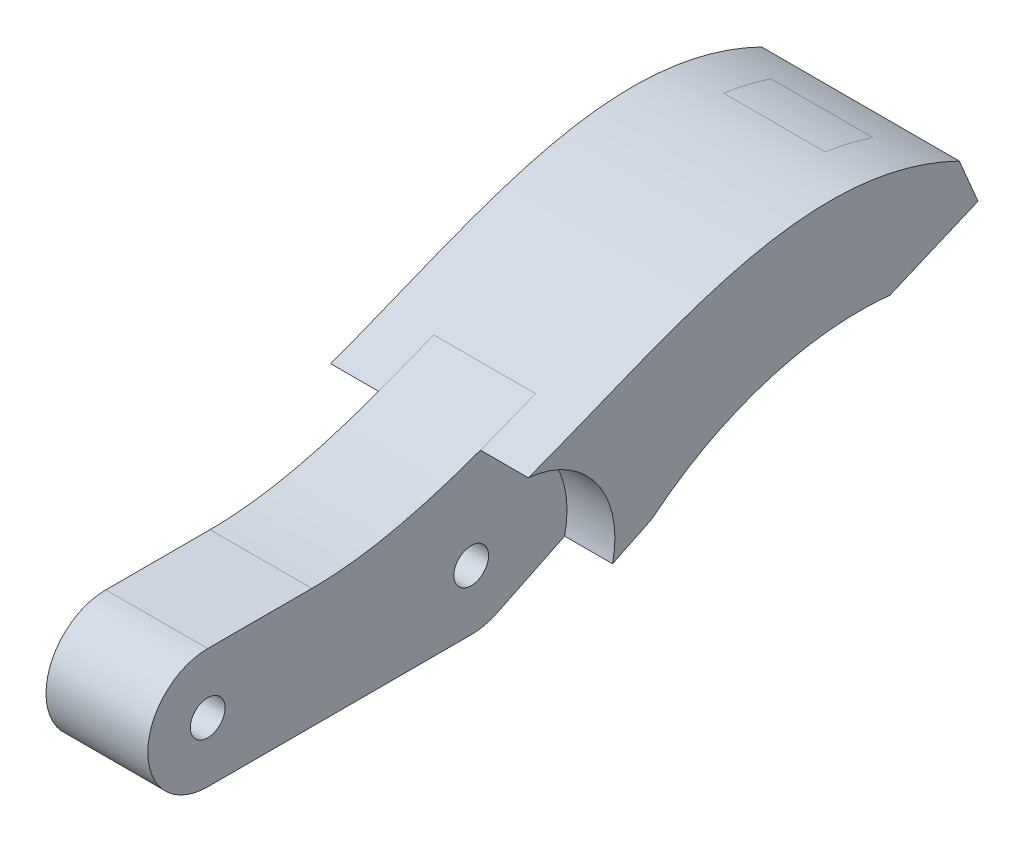
ISO-10303-21;
HEADER;
FILE_DESCRIPTION(('STEP AP214'),'2;1');
FILE_NAME('part.step','',(''),(''),'','','');
FILE_SCHEMA(('AUTOMOTIVE_DESIGN { 1 0 10303 214 1 1 1 1 }'));
ENDSEC;
DATA;
#1=APPLICATION_CONTEXT('core data for automotive mechanical design processes');
#2=APPLICATION_PROTOCOL_DEFINITION('international standard','automotive_design',2000,#1);
#3=PRODUCT_CONTEXT('',#1,'mechanical');
#4=PRODUCT('Part','Part','',(#3));
#5=PRODUCT_RELATED_PRODUCT_CATEGORY('part','',(#4));
#6=PRODUCT_DEFINITION_FORMATION('','',#4);
#7=PRODUCT_DEFINITION_CONTEXT('part definition',#1,'design');
#8=PRODUCT_DEFINITION('design','',#6,#7);
#9=PRODUCT_DEFINITION_SHAPE('','',#8);
#10=(LENGTH_UNIT() NAMED_UNIT(*) SI_UNIT(.MILLI.,.METRE.));
#11=(NAMED_UNIT(*) PLANE_ANGLE_UNIT() SI_UNIT($,.RADIAN.));
#12=(NAMED_UNIT(*) SI_UNIT($,.STERADIAN.) SOLID_ANGLE_UNIT());
#13=UNCERTAINTY_MEASURE_WITH_UNIT(LENGTH_MEASURE(1.E-05),#10,'distance_accuracy_value','');
#14=(GEOMETRIC_REPRESENTATION_CONTEXT(3) GLOBAL_UNCERTAINTY_ASSIGNED_CONTEXT((#13)) GLOBAL_UNIT_ASSIGNED_CONTEXT((#10,
#11,#12)) REPRESENTATION_CONTEXT('',''));
#15=CARTESIAN_POINT('',(0.,0.,0.));
#16=DIRECTION('',(0.,0.,1.));
#17=DIRECTION('',(1.,0.,0.));
#18=AXIS2_PLACEMENT_3D('',#15,#16,#17);
#19=CARTESIAN_POINT('',(0.,4.82408407678908,-38.0854206599091));
#20=CARTESIAN_POINT('',(0.,11.8952224566425,-46.7975095094647));
#21=CARTESIAN_POINT('',(0.,11.0678436667493,-57.9480004086976));
#22=B_SPLINE_CURVE_WITH_KNOTS('',2,(#19,#20,#21),.UNSPECIFIED.,.F.,.F.,(3,3),(0.,1.),.UNSPECIFIED.);
#23=DIRECTION('',(1.,0.,0.));
#24=VECTOR('',#23,1.);
#25=SURFACE_OF_LINEAR_EXTRUSION('',#22,#24);
#26=DIRECTION('',(1.,0.,0.));
#27=VECTOR('',#26,1.);
#28=CARTESIAN_POINT('',(-4.,7.15852189131688,-41.3734875650252));
#29=LINE('',#28,#27);
#30=CARTESIAN_POINT('',(8.5,7.15852189131688,-41.3734875650252));
#31=VERTEX_POINT('',#30);
#32=CARTESIAN_POINT('',(0.,7.15852189131688,-41.3734875650252));
#33=VERTEX_POINT('',#32);
#34=EDGE_CURVE('E74',#31,#33,#29,.F.);
#35=ORIENTED_EDGE('',*,*,#34,.F.);
#36=CARTESIAN_POINT('',(8.5,4.82408407678908,-38.0854206599091));
#37=CARTESIAN_POINT('',(8.5,5.67784014833493,-39.123058882647));
#38=CARTESIAN_POINT('',(8.5,6.45866239445164,-40.2230975282435));
#39=CARTESIAN_POINT('',(8.5,7.15852189131688,-41.3734875650252));
#40=B_SPLINE_CURVE_WITH_KNOTS('',3,(#36,#37,#38,#39),.UNSPECIFIED.,.F.,.F.,(4,4),(0.,
0.189560065415146),.UNSPECIFIED.);
#41=CARTESIAN_POINT('',(8.5,4.82408407678908,-38.0854206599091));
#42=VERTEX_POINT('',#41);
#43=EDGE_CURVE('E325',#42,#31,#40,.T.);
#44=ORIENTED_EDGE('',*,*,#43,.F.);
#45=DIRECTION('',(1.,0.,0.));
#46=VECTOR('',#45,1.);
#47=CARTESIAN_POINT('',(0.,4.82408407678908,-38.0854206599091));
#48=LINE('',#47,#46);
#49=CARTESIAN_POINT('',(0.,4.82408407678908,-38.0854206599091));
#50=VERTEX_POINT('',#49);
#51=EDGE_CURVE('E365',#50,#42,#48,.T.);
#52=ORIENTED_EDGE('',*,*,#51,.F.);
#53=CARTESIAN_POINT('',(0.,4.82408407678908,-38.0854206599091));
#54=CARTESIAN_POINT('',(0.,6.12496654221794,-39.6881899755169));
#55=CARTESIAN_POINT('',(0.,7.15852189131688,-41.3734875650252));
#56=B_SPLINE_CURVE_WITH_KNOTS('',2,(#53,#54,#55),.UNSPECIFIED.,.F.,.F.,(3,3),(0.,
0.183970726571446),.UNSPECIFIED.);
#57=EDGE_CURVE('E69',#50,#33,#56,.T.);
#58=ORIENTED_EDGE('',*,*,#57,.T.);
#59=EDGE_LOOP('',(#35,#44,#52,#58));
#60=FACE_BOUND('',#59,.T.);
#61=ADVANCED_FACE('F49',(#60),#25,.T.);
#62=CARTESIAN_POINT('',(8.5,5.,-27.));
#63=DIRECTION('',(-1.,0.,0.));
#64=DIRECTION('',(0.,0.,1.));
#65=AXIS2_PLACEMENT_3D('',#62,#63,#64);
#66=CYLINDRICAL_SURFACE('',#65,5.);
#67=DIRECTION('',(1.,0.,0.));
#68=VECTOR('',#67,1.);
#69=CARTESIAN_POINT('',(0.,0.502127655445501,-29.1838370754458));
#70=LINE('',#69,#68);
#71=CARTESIAN_POINT('',(0.,0.502127655445501,-29.1838370754458));
#72=VERTEX_POINT('',#71);
#73=CARTESIAN_POINT('',(8.5,0.502127655445501,-29.1838370754458));
#74=VERTEX_POINT('',#73);
#75=EDGE_CURVE('E366',#72,#74,#70,.T.);
#76=ORIENTED_EDGE('',*,*,#75,.T.);
#77=CARTESIAN_POINT('',(8.5,5.,-27.));
#78=DIRECTION('',(1.,0.,0.));
#79=DIRECTION('',(0.,0.,-1.));
#80=AXIS2_PLACEMENT_3D('',#77,#78,#79);
#81=CIRCLE('',#80,5.);
#82=CARTESIAN_POINT('',(8.5,0.,-27.));
#83=VERTEX_POINT('',#82);
#84=EDGE_CURVE('E384',#83,#74,#81,.T.);
#85=ORIENTED_EDGE('',*,*,#84,.F.);
#86=DIRECTION('',(-1.,0.,0.));
#87=VECTOR('',#86,1.);
#88=CARTESIAN_POINT('',(8.5,0.,-27.));
#89=LINE('',#88,#87);
#90=CARTESIAN_POINT('',(0.,0.,-27.));
#91=VERTEX_POINT('',#90);
#92=EDGE_CURVE('E396',#83,#91,#89,.T.);
#93=ORIENTED_EDGE('',*,*,#92,.T.);
#94=CARTESIAN_POINT('',(0.,5.,-27.));
#95=DIRECTION('',(1.,0.,0.));
#96=DIRECTION('',(0.,0.,-1.));
#97=AXIS2_PLACEMENT_3D('',#94,#95,#96);
#98=CIRCLE('',#97,5.);
#99=EDGE_CURVE('E406',#91,#72,#98,.T.);
#100=ORIENTED_EDGE('',*,*,#99,.T.);
#101=EDGE_LOOP('',(#76,#85,#93,#100));
#102=FACE_BOUND('',#101,.T.);
#103=ADVANCED_FACE('F616',(#102),#66,.T.);
#104=CARTESIAN_POINT('',(8.5,10.,0.));
#105=DIRECTION('',(0.,1.,0.));
#106=DIRECTION('',(0.,0.,1.));
#107=AXIS2_PLACEMENT_3D('',#104,#105,#106);
#108=PLANE('',#107);
#109=DIRECTION('',(1.,0.,0.));
#110=VECTOR('',#109,1.);
#111=CARTESIAN_POINT('',(0.,10.,-13.6949747586838));
#112=LINE('',#111,#110);
#113=CARTESIAN_POINT('',(0.,10.,-13.6949747586838));
#114=VERTEX_POINT('',#113);
#115=CARTESIAN_POINT('',(8.5,10.,-13.6949747586838));
#116=VERTEX_POINT('',#115);
#117=EDGE_CURVE('E208',#114,#116,#112,.T.);
#118=ORIENTED_EDGE('',*,*,#117,.F.);
#119=DIRECTION('',(0.,0.,-1.));
#120=VECTOR('',#119,1.);
#121=CARTESIAN_POINT('',(0.,10.,0.));
#122=LINE('',#121,#120);
#123=CARTESIAN_POINT('',(0.,10.,-5.));
#124=VERTEX_POINT('',#123);
#125=EDGE_CURVE('E360',#124,#114,#122,.T.);
#126=ORIENTED_EDGE('',*,*,#125,.F.);
#127=DIRECTION('',(-1.,0.,0.));
#128=VECTOR('',#127,1.);
#129=CARTESIAN_POINT('',(8.5,10.,-5.));
#130=LINE('',#129,#128);
#131=CARTESIAN_POINT('',(8.5,10.,-5.));
#132=VERTEX_POINT('',#131);
#133=EDGE_CURVE('E329',#132,#124,#130,.T.);
#134=ORIENTED_EDGE('',*,*,#133,.F.);
#135=DIRECTION('',(0.,0.,-1.));
#136=VECTOR('',#135,1.);
#137=CARTESIAN_POINT('',(8.5,10.,0.));
#138=LINE('',#137,#136);
#139=EDGE_CURVE('E373',#132,#116,#138,.T.);
#140=ORIENTED_EDGE('',*,*,#139,.T.);
#141=EDGE_LOOP('',(#118,#126,#134,#140));
#142=FACE_BOUND('',#141,.T.);
#143=ADVANCED_FACE('F51',(#142),#108,.T.);
#144=CARTESIAN_POINT('',(8.5,5.,-5.));
#145=DIRECTION('',(-1.,0.,0.));
#146=DIRECTION('',(0.,0.,1.));
#147=AXIS2_PLACEMENT_3D('',#144,#145,#146);
#148=CYLINDRICAL_SURFACE('',#147,5.);
#149=CARTESIAN_POINT('',(0.,5.,-5.));
#150=DIRECTION('',(1.,0.,0.));
#151=DIRECTION('',(0.,0.,-1.));
#152=AXIS2_PLACEMENT_3D('',#149,#150,#151);
#153=CIRCLE('',#152,5.);
#154=CARTESIAN_POINT('',(0.,0.,-5.));
#155=VERTEX_POINT('',#154);
#156=EDGE_CURVE('E400',#124,#155,#153,.T.);
#157=ORIENTED_EDGE('',*,*,#156,.T.);
#158=DIRECTION('',(-1.,0.,0.));
#159=VECTOR('',#158,1.);
#160=CARTESIAN_POINT('',(8.5,0.,-5.));
#161=LINE('',#160,#159);
#162=CARTESIAN_POINT('',(8.5,0.,-5.));
#163=VERTEX_POINT('',#162);
#164=EDGE_CURVE('E419',#163,#155,#161,.T.);
#165=ORIENTED_EDGE('',*,*,#164,.F.);
#166=CARTESIAN_POINT('',(8.5,5.,-5.));
#167=DIRECTION('',(1.,0.,0.));
#168=DIRECTION('',(0.,0.,-1.));
#169=AXIS2_PLACEMENT_3D('',#166,#167,#168);
#170=CIRCLE('',#169,5.);
#171=EDGE_CURVE('E377',#132,#163,#170,.T.);
#172=ORIENTED_EDGE('',*,*,#171,.F.);
#173=ORIENTED_EDGE('',*,*,#133,.T.);
#174=EDGE_LOOP('',(#157,#165,#172,#173));
#175=FACE_BOUND('',#174,.T.);
#176=ADVANCED_FACE('F493',(#175),#148,.T.);
#177=CARTESIAN_POINT('',(8.5,0.,0.));
#178=DIRECTION('',(0.,1.,0.));
#179=DIRECTION('',(0.,0.,1.));
#180=AXIS2_PLACEMENT_3D('',#177,#178,#179);
#181=PLANE('',#180);
#182=DIRECTION('',(0.,0.,-1.));
#183=VECTOR('',#182,1.);
#184=CARTESIAN_POINT('',(0.,0.,0.));
#185=LINE('',#184,#183);
#186=EDGE_CURVE('E403',#155,#91,#185,.T.);
#187=ORIENTED_EDGE('',*,*,#186,.T.);
#188=ORIENTED_EDGE('',*,*,#92,.F.);
#189=DIRECTION('',(0.,0.,-1.));
#190=VECTOR('',#189,1.);
#191=CARTESIAN_POINT('',(8.5,0.,0.));
#192=LINE('',#191,#190);
#193=EDGE_CURVE('E381',#163,#83,#192,.T.);
#194=ORIENTED_EDGE('',*,*,#193,.F.);
#195=ORIENTED_EDGE('',*,*,#164,.T.);
#196=EDGE_LOOP('',(#187,#188,#194,#195));
#197=FACE_BOUND('',#196,.T.);
#198=ADVANCED_FACE('F495',(#197),#181,.F.);
#199=CARTESIAN_POINT('',(8.5,5.,-5.));
#200=DIRECTION('',(-1.,0.,0.));
#201=DIRECTION('',(0.,0.,1.));
#202=AXIS2_PLACEMENT_3D('',#199,#200,#201);
#203=CYLINDRICAL_SURFACE('',#202,1.45);
#204=CARTESIAN_POINT('',(8.5,5.,-5.));
#205=DIRECTION('',(1.,0.,0.));
#206=DIRECTION('',(0.,0.,-1.));
#207=AXIS2_PLACEMENT_3D('',#204,#205,#206);
#208=CIRCLE('',#207,1.45);
#209=CARTESIAN_POINT('',(8.5,5.,-6.45));
#210=VERTEX_POINT('',#209);
#211=EDGE_CURVE('E388',#210,#210,#208,.T.);
#212=ORIENTED_EDGE('',*,*,#211,.T.);
#213=EDGE_LOOP('',(#212));
#214=FACE_BOUND('',#213,.T.);
#215=CARTESIAN_POINT('',(0.,5.,-5.));
#216=DIRECTION('',(1.,0.,0.));
#217=DIRECTION('',(0.,0.,-1.));
#218=AXIS2_PLACEMENT_3D('',#215,#216,#217);
#219=CIRCLE('',#218,1.45);
#220=CARTESIAN_POINT('',(0.,5.,-6.45));
#221=VERTEX_POINT('',#220);
#222=EDGE_CURVE('E410',#221,#221,#219,.T.);
#223=ORIENTED_EDGE('',*,*,#222,.F.);
#224=EDGE_LOOP('',(#223));
#225=FACE_BOUND('',#224,.T.);
#226=ADVANCED_FACE('F801',(#214,#225),#203,.F.);
#227=CARTESIAN_POINT('',(8.5,5.,-27.));
#228=DIRECTION('',(-1.,0.,0.));
#229=DIRECTION('',(0.,0.,1.));
#230=AXIS2_PLACEMENT_3D('',#227,#228,#229);
#231=CYLINDRICAL_SURFACE('',#230,1.45);
#232=CARTESIAN_POINT('',(8.5,5.,-27.));
#233=DIRECTION('',(1.,0.,0.));
#234=DIRECTION('',(0.,0.,-1.));
#235=AXIS2_PLACEMENT_3D('',#232,#233,#234);
#236=CIRCLE('',#235,1.45);
#237=CARTESIAN_POINT('',(8.5,5.,-28.45));
#238=VERTEX_POINT('',#237);
#239=EDGE_CURVE('E392',#238,#238,#236,.T.);
#240=ORIENTED_EDGE('',*,*,#239,.T.);
#241=EDGE_LOOP('',(#240));
#242=FACE_BOUND('',#241,.T.);
#243=CARTESIAN_POINT('',(0.,5.,-27.));
#244=DIRECTION('',(1.,0.,0.));
#245=DIRECTION('',(0.,0.,-1.));
#246=AXIS2_PLACEMENT_3D('',#243,#244,#245);
#247=CIRCLE('',#246,1.45);
#248=CARTESIAN_POINT('',(0.,5.,-28.45));
#249=VERTEX_POINT('',#248);
#250=EDGE_CURVE('E378',#249,#249,#247,.T.);
#251=ORIENTED_EDGE('',*,*,#250,.F.);
#252=EDGE_LOOP('',(#251));
#253=FACE_BOUND('',#252,.T.);
#254=ADVANCED_FACE('F790',(#242,#253),#231,.F.);
#255=CARTESIAN_POINT('',(8.5,0.,0.));
#256=DIRECTION('',(1.,0.,0.));
#257=DIRECTION('',(0.,0.,-1.));
#258=AXIS2_PLACEMENT_3D('',#255,#256,#257);
#259=PLANE('',#258);
#260=CARTESIAN_POINT('',(8.5,5.,-27.));
#261=DIRECTION('',(1.,0.,0.));
#262=DIRECTION('',(0.,0.,-1.));
#263=AXIS2_PLACEMENT_3D('',#260,#261,#262);
#264=CIRCLE('',#263,8.);
#265=CARTESIAN_POINT('',(8.5,12.9626284684492,-27.7723651166656));
#266=VERTEX_POINT('',#265);
#267=CARTESIAN_POINT('',(8.5,3.229739288443,-34.8016778332047));
#268=VERTEX_POINT('',#267);
#269=EDGE_CURVE('E501',#266,#268,#264,.F.);
#270=ORIENTED_EDGE('',*,*,#269,.F.);
#271=CARTESIAN_POINT('',(8.5,17.8724231173908,-63.7529722863132));
#272=CARTESIAN_POINT('',(8.5,26.563787962677,-45.9288826779558));
#273=CARTESIAN_POINT('',(8.5,9.99999999999999,-31.059268620705));
#274=CARTESIAN_POINT('',(8.5,10.,-13.6949747586838));
#275=B_SPLINE_CURVE_WITH_KNOTS('',3,(#271,#272,#273,#274),.UNSPECIFIED.,.F.,.F.,(4,4),(0.,1.),.UNSPECIFIED.);
#276=EDGE_CURVE('E322',#266,#116,#275,.T.);
#277=ORIENTED_EDGE('',*,*,#276,.T.);
#278=ORIENTED_EDGE('',*,*,#139,.F.);
#279=ORIENTED_EDGE('',*,*,#171,.T.);
#280=ORIENTED_EDGE('',*,*,#193,.T.);
#281=ORIENTED_EDGE('',*,*,#84,.T.);
#282=DIRECTION('',(0.,0.436767415089167,-0.8995744689109));
#283=VECTOR('',#282,1.);
#284=CARTESIAN_POINT('',(8.5,-11.0601312365663,-5.36998891997289));
#285=LINE('',#284,#283);
#286=EDGE_CURVE('E321',#74,#268,#285,.T.);
#287=ORIENTED_EDGE('',*,*,#286,.T.);
#288=EDGE_LOOP('',(#270,#277,#278,#279,#280,#281,#287));
#289=FACE_BOUND('',#288,.T.);
#290=ORIENTED_EDGE('',*,*,#211,.F.);
#291=EDGE_LOOP('',(#290));
#292=FACE_BOUND('',#291,.T.);
#293=ORIENTED_EDGE('',*,*,#239,.F.);
#294=EDGE_LOOP('',(#293));
#295=FACE_BOUND('',#294,.T.);
#296=ADVANCED_FACE('F498',(#289,#292,#295),#259,.T.);
#297=CARTESIAN_POINT('',(0.,0.,0.));
#298=DIRECTION('',(1.,0.,0.));
#299=DIRECTION('',(0.,0.,-1.));
#300=AXIS2_PLACEMENT_3D('',#297,#298,#299);
#301=PLANE('',#300);
#302=CARTESIAN_POINT('',(0.,17.8724231173908,-63.7529722863132));
#303=CARTESIAN_POINT('',(0.,26.563787962677,-45.9288826779558));
#304=CARTESIAN_POINT('',(0.,9.99999999999999,-31.059268620705));
#305=CARTESIAN_POINT('',(0.,10.,-13.6949747586838));
#306=B_SPLINE_CURVE_WITH_KNOTS('',3,(#302,#303,#304,#305),.UNSPECIFIED.,.F.,.F.,(4,4),(0.,1.),.UNSPECIFIED.);
#307=CARTESIAN_POINT('',(0.,12.9626284684492,-27.7723651166656));
#308=VERTEX_POINT('',#307);
#309=EDGE_CURVE('E353',#308,#114,#306,.T.);
#310=ORIENTED_EDGE('',*,*,#309,.F.);
#311=CARTESIAN_POINT('',(0.,5.,-27.));
#312=DIRECTION('',(1.,0.,0.));
#313=DIRECTION('',(0.,0.,-1.));
#314=AXIS2_PLACEMENT_3D('',#311,#312,#313);
#315=CIRCLE('',#314,8.);
#316=CARTESIAN_POINT('',(0.,3.229739288443,-34.8016778332047));
#317=VERTEX_POINT('',#316);
#318=EDGE_CURVE('E506',#308,#317,#315,.F.);
#319=ORIENTED_EDGE('',*,*,#318,.T.);
#320=DIRECTION('',(0.,0.436767415089167,-0.8995744689109));
#321=VECTOR('',#320,1.);
#322=CARTESIAN_POINT('',(0.,-11.0601312365663,-5.36998891997289));
#323=LINE('',#322,#321);
#324=EDGE_CURVE('E472',#72,#317,#323,.T.);
#325=ORIENTED_EDGE('',*,*,#324,.F.);
#326=ORIENTED_EDGE('',*,*,#99,.F.);
#327=ORIENTED_EDGE('',*,*,#186,.F.);
#328=ORIENTED_EDGE('',*,*,#156,.F.);
#329=ORIENTED_EDGE('',*,*,#125,.T.);
#330=EDGE_LOOP('',(#310,#319,#325,#326,#327,#328,#329));
#331=FACE_BOUND('',#330,.T.);
#332=ORIENTED_EDGE('',*,*,#222,.T.);
#333=EDGE_LOOP('',(#332));
#334=FACE_BOUND('',#333,.T.);
#335=ORIENTED_EDGE('',*,*,#250,.T.);
#336=EDGE_LOOP('',(#335));
#337=FACE_BOUND('',#336,.T.);
#338=ADVANCED_FACE('F490',(#331,#334,#337),#301,.F.);
#339=CARTESIAN_POINT('',(0.,-11.0601312365663,-5.36998891997289));
#340=DIRECTION('',(0.,-0.8995744689109,-0.436767415089167));
#341=DIRECTION('',(0.,0.436767415089167,-0.8995744689109));
#342=AXIS2_PLACEMENT_3D('',#339,#340,#341);
#343=PLANE('',#342);
#344=ORIENTED_EDGE('',*,*,#324,.T.);
#345=DIRECTION('',(1.,0.,0.));
#346=VECTOR('',#345,1.);
#347=CARTESIAN_POINT('',(-4.,3.22973928844299,-34.8016778332047));
#348=LINE('',#347,#346);
#349=CARTESIAN_POINT('',(-4.,3.22973928844299,-34.8016778332047));
#350=VERTEX_POINT('',#349);
#351=EDGE_CURVE('E574',#350,#317,#348,.T.);
#352=ORIENTED_EDGE('',*,*,#351,.F.);
#353=DIRECTION('',(0.,0.436767415089167,-0.8995744689109));
#354=VECTOR('',#353,1.);
#355=CARTESIAN_POINT('',(-4.,4.82408407678908,-38.0854206599091));
#356=LINE('',#355,#354);
#357=CARTESIAN_POINT('',(-4.,4.82408407678908,-38.0854206599091));
#358=VERTEX_POINT('',#357);
#359=EDGE_CURVE('E563',#350,#358,#356,.T.);
#360=ORIENTED_EDGE('',*,*,#359,.T.);
#361=DIRECTION('',(1.,0.,0.));
#362=VECTOR('',#361,1.);
#363=CARTESIAN_POINT('',(-4.,4.82408407678908,-38.0854206599091));
#364=LINE('',#363,#362);
#365=EDGE_CURVE('E537',#358,#50,#364,.T.);
#366=ORIENTED_EDGE('',*,*,#365,.T.);
#367=ORIENTED_EDGE('',*,*,#51,.T.);
#368=CARTESIAN_POINT('',(12.5,4.82408407678908,-38.0854206599091));
#369=VERTEX_POINT('',#368);
#370=EDGE_CURVE('E469',#42,#369,#364,.T.);
#371=ORIENTED_EDGE('',*,*,#370,.T.);
#372=DIRECTION('',(0.,0.436767415089167,-0.8995744689109));
#373=VECTOR('',#372,1.);
#374=CARTESIAN_POINT('',(12.5,4.82408407678908,-38.0854206599091));
#375=LINE('',#374,#373);
#376=CARTESIAN_POINT('',(12.5,3.22973928844299,-34.8016778332047));
#377=VERTEX_POINT('',#376);
#378=EDGE_CURVE('E240',#377,#369,#375,.T.);
#379=ORIENTED_EDGE('',*,*,#378,.F.);
#380=EDGE_CURVE('E579',#268,#377,#348,.T.);
#381=ORIENTED_EDGE('',*,*,#380,.F.);
#382=ORIENTED_EDGE('',*,*,#286,.F.);
#383=ORIENTED_EDGE('',*,*,#75,.F.);
#384=EDGE_LOOP('',(#344,#352,#360,#366,#367,#371,#379,#381,#382,#383));
#385=FACE_BOUND('',#384,.T.);
#386=ADVANCED_FACE('F460',(#385),#343,.T.);
#387=DIRECTION('',(1.,0.,0.));
#388=VECTOR('',#387,1.);
#389=SURFACE_OF_LINEAR_EXTRUSION('',#306,#388);
#390=ORIENTED_EDGE('',*,*,#276,.F.);
#391=CARTESIAN_POINT('',(8.5,13.2116007519846,-28.4462012675308));
#392=VERTEX_POINT('',#391);
#393=EDGE_CURVE('E313',#392,#266,#275,.T.);
#394=ORIENTED_EDGE('',*,*,#393,.F.);
#395=CARTESIAN_POINT('',(8.5,14.7448653273743,-32.3710230463123));
#396=CARTESIAN_POINT('',(8.5,14.2208307799612,-31.0678163159321));
#397=CARTESIAN_POINT('',(8.5,13.7030985801309,-29.7619731574848));
#398=CARTESIAN_POINT('',(8.5,13.2116071982536,-28.4461988595546));
#399=B_SPLINE_CURVE_WITH_KNOTS('',3,(#395,#396,#397,#398),.UNSPECIFIED.,.F.,.F.,(4,4),
(0.86873836810983,0.98088198089865),.UNSPECIFIED.);
#400=CARTESIAN_POINT('',(8.5,14.7448653273959,-32.3710230463658));
#401=VERTEX_POINT('',#400);
#402=EDGE_CURVE('E312',#401,#392,#399,.T.);
#403=ORIENTED_EDGE('',*,*,#402,.F.);
#404=DIRECTION('',(1.,0.,0.));
#405=VECTOR('',#404,1.);
#406=CARTESIAN_POINT('',(-4.,14.7448653273959,-32.3710230463658));
#407=LINE('',#406,#405);
#408=CARTESIAN_POINT('',(0.,14.7448653273959,-32.3710230463658));
#409=VERTEX_POINT('',#408);
#410=EDGE_CURVE('E314',#409,#401,#407,.T.);
#411=ORIENTED_EDGE('',*,*,#410,.F.);
#412=CARTESIAN_POINT('',(0.,14.7448653273959,-32.3710230463658));
#413=CARTESIAN_POINT('',(0.,14.2203932900155,-31.0666572510012));
#414=CARTESIAN_POINT('',(0.,13.7021109035433,-29.7593207536411));
#415=CARTESIAN_POINT('',(0.,13.2116007519846,-28.4462012675308));
#416=B_SPLINE_CURVE_WITH_KNOTS('',3,(#412,#413,#414,#415),.UNSPECIFIED.,.F.,.F.,(4,4),
(0.626920756512848,0.707133518454288),.UNSPECIFIED.);
#417=CARTESIAN_POINT('',(0.,13.2116007519846,-28.4462012675308));
#418=VERTEX_POINT('',#417);
#419=EDGE_CURVE('E303',#409,#418,#416,.T.);
#420=ORIENTED_EDGE('',*,*,#419,.T.);
#421=EDGE_CURVE('E478',#418,#308,#306,.T.);
#422=ORIENTED_EDGE('',*,*,#421,.T.);
#423=ORIENTED_EDGE('',*,*,#309,.T.);
#424=ORIENTED_EDGE('',*,*,#117,.T.);
#425=EDGE_LOOP('',(#390,#394,#403,#411,#420,#422,#423,#424));
#426=FACE_BOUND('',#425,.T.);
#427=ADVANCED_FACE('F273',(#426),#389,.T.);
#428=CARTESIAN_POINT('',(-4.,17.8724231173908,-63.7529722863132));
#429=CARTESIAN_POINT('',(-4.,19.0434579188821,-61.3695563233712));
#430=CARTESIAN_POINT('',(-4.,20.4805279895905,-56.7492985407225));
#431=CARTESIAN_POINT('',(-4.,20.4388788645331,-50.3654494628664));
#432=CARTESIAN_POINT('',(-4.,19.4766918966686,-45.4379354110484));
#433=CARTESIAN_POINT('',(-4.,18.1888539669879,-41.1808071157356));
#434=CARTESIAN_POINT('',(-4.,16.5861132832005,-36.9000226238489));
#435=CARTESIAN_POINT('',(-4.,14.7472254958844,-32.4024329725984));
#436=CARTESIAN_POINT('',(-4.,13.5267578411651,-29.3166614691765));
#437=CARTESIAN_POINT('',(-4.,12.9626284684492,-27.7723651166658));
#438=B_SPLINE_CURVE_WITH_KNOTS('',3,(#428,#429,#430,#431,#432,#433,#434,#435,#436,#437),
.UNSPECIFIED.,.F.,.F.,(4,1,1,1,1,1,1,4),(0.,0.212092216635368,0.380339188658808,
0.503919340390557,0.612037820514027,0.73509031467797,0.86873836810983,1.),.UNSPECIFIED.);
#439=DIRECTION('',(1.,0.,0.));
#440=VECTOR('',#439,1.);
#441=SURFACE_OF_LINEAR_EXTRUSION('',#438,#440);
#442=ORIENTED_EDGE('',*,*,#410,.T.);
#443=ORIENTED_EDGE('',*,*,#402,.T.);
#444=ORIENTED_EDGE('',*,*,#393,.T.);
#445=DIRECTION('',(1.,0.,0.));
#446=VECTOR('',#445,1.);
#447=CARTESIAN_POINT('',(-4.,12.9626284684492,-27.7723651166658));
#448=LINE('',#447,#446);
#449=CARTESIAN_POINT('',(12.5,12.9626284684492,-27.7723651166658));
#450=VERTEX_POINT('',#449);
#451=EDGE_CURVE('E218',#266,#450,#448,.T.);
#452=ORIENTED_EDGE('',*,*,#451,.T.);
#453=CARTESIAN_POINT('',(12.5,17.8724231173908,-63.7529722863132));
#454=CARTESIAN_POINT('',(12.5,19.0434579188821,-61.3695563233712));
#455=CARTESIAN_POINT('',(12.5,20.4805279895905,-56.7492985407225));
#456=CARTESIAN_POINT('',(12.5,20.4388788645331,-50.3654494628664));
#457=CARTESIAN_POINT('',(12.5,19.4766918966686,-45.4379354110484));
#458=CARTESIAN_POINT('',(12.5,18.1888539669879,-41.1808071157356));
#459=CARTESIAN_POINT('',(12.5,16.5861132832005,-36.9000226238489));
#460=CARTESIAN_POINT('',(12.5,14.7472254958844,-32.4024329725984));
#461=CARTESIAN_POINT('',(12.5,13.5267578411651,-29.3166614691765));
#462=CARTESIAN_POINT('',(12.5,12.9626284684492,-27.7723651166658));
#463=B_SPLINE_CURVE_WITH_KNOTS('',3,(#453,#454,#455,#456,#457,#458,#459,#460,#461,#462),
.UNSPECIFIED.,.F.,.F.,(4,1,1,1,1,1,1,4),(0.,0.212092216635368,0.380339188658808,
0.503919340390557,0.612037820514027,0.73509031467797,0.86873836810983,1.),.UNSPECIFIED.);
#464=CARTESIAN_POINT('',(12.5,17.8724231173908,-63.7529722863132));
#465=VERTEX_POINT('',#464);
#466=EDGE_CURVE('E212',#465,#450,#463,.T.);
#467=ORIENTED_EDGE('',*,*,#466,.F.);
#468=DIRECTION('',(1.,0.,0.));
#469=VECTOR('',#468,1.);
#470=CARTESIAN_POINT('',(0.,17.8724231173908,-63.7529722863132));
#471=LINE('',#470,#469);
#472=CARTESIAN_POINT('',(-4.,17.8724231173908,-63.7529722863132));
#473=VERTEX_POINT('',#472);
#474=EDGE_CURVE('E197',#473,#465,#471,.T.);
#475=ORIENTED_EDGE('',*,*,#474,.F.);
#476=CARTESIAN_POINT('',(-4.,12.9626284684492,-27.7723651166658));
#477=VERTEX_POINT('',#476);
#478=EDGE_CURVE('E256',#473,#477,#438,.T.);
#479=ORIENTED_EDGE('',*,*,#478,.T.);
#480=EDGE_CURVE('E580',#477,#308,#448,.T.);
#481=ORIENTED_EDGE('',*,*,#480,.T.);
#482=ORIENTED_EDGE('',*,*,#421,.F.);
#483=ORIENTED_EDGE('',*,*,#419,.F.);
#484=EDGE_LOOP('',(#442,#443,#444,#452,#467,#475,#479,#481,#482,#483));
#485=FACE_BOUND('',#484,.T.);
#486=CARTESIAN_POINT('',(8.5,19.1900188866908,-60.5244021086021));
#487=CARTESIAN_POINT('',(8.5,19.6148683187156,-59.2321858748492));
#488=CARTESIAN_POINT('',(8.5,19.9331141594222,-57.9045401039695));
#489=CARTESIAN_POINT('',(8.5,20.1331277274908,-56.5590376057387));
#490=B_SPLINE_CURVE_WITH_KNOTS('',3,(#486,#487,#488,#489),.UNSPECIFIED.,.F.,.F.,(4,4),
(0.0928045111625802,0.201253485145239),.UNSPECIFIED.);
#491=CARTESIAN_POINT('',(8.5,19.1900188866908,-60.5244021086021));
#492=VERTEX_POINT('',#491);
#493=CARTESIAN_POINT('',(8.5,20.1331277274908,-56.5590376057387));
#494=VERTEX_POINT('',#493);
#495=EDGE_CURVE('E318',#492,#494,#490,.T.);
#496=ORIENTED_EDGE('',*,*,#495,.T.);
#497=DIRECTION('',(1.,0.,0.));
#498=VECTOR('',#497,1.);
#499=CARTESIAN_POINT('',(-4.,20.1331277274908,-56.5590376057387));
#500=LINE('',#499,#498);
#501=CARTESIAN_POINT('',(0.,20.1331277274908,-56.5590376057387));
#502=VERTEX_POINT('',#501);
#503=EDGE_CURVE('E61',#494,#502,#500,.F.);
#504=ORIENTED_EDGE('',*,*,#503,.T.);
#505=CARTESIAN_POINT('',(0.,19.1900188866908,-60.5244021086021));
#506=CARTESIAN_POINT('',(0.,19.6307971014306,-59.1881072789941));
#507=CARTESIAN_POINT('',(0.,19.9389432668141,-57.8671300486076));
#508=CARTESIAN_POINT('',(0.,20.1331277274908,-56.5590376057387));
#509=B_SPLINE_CURVE_WITH_KNOTS('',3,(#505,#506,#507,#508),.UNSPECIFIED.,.F.,.F.,(4,4),
(0.0609715117586594,0.137400791849501),.UNSPECIFIED.);
#510=CARTESIAN_POINT('',(0.,19.1900188866908,-60.5244021086021));
#511=VERTEX_POINT('',#510);
#512=EDGE_CURVE('E483',#511,#502,#509,.T.);
#513=ORIENTED_EDGE('',*,*,#512,.F.);
#514=DIRECTION('',(1.,0.,0.));
#515=VECTOR('',#514,1.);
#516=CARTESIAN_POINT('',(-4.,19.1900188866908,-60.5244021086021));
#517=LINE('',#516,#515);
#518=EDGE_CURVE('E11',#511,#492,#517,.T.);
#519=ORIENTED_EDGE('',*,*,#518,.T.);
#520=EDGE_LOOP('',(#496,#504,#513,#519));
#521=FACE_BOUND('',#520,.T.);
#522=ADVANCED_FACE('F214',(#485,#521),#441,.T.);
#523=CARTESIAN_POINT('',(-4.,5.,-27.));
#524=DIRECTION('',(1.,0.,0.));
#525=DIRECTION('',(0.,0.,-1.));
#526=AXIS2_PLACEMENT_3D('',#523,#524,#525);
#527=CYLINDRICAL_SURFACE('',#526,8.);
#528=ORIENTED_EDGE('',*,*,#318,.F.);
#529=ORIENTED_EDGE('',*,*,#480,.F.);
#530=CARTESIAN_POINT('',(-4.,5.,-27.));
#531=DIRECTION('',(-1.,0.,0.));
#532=DIRECTION('',(0.,0.,-1.));
#533=AXIS2_PLACEMENT_3D('',#530,#531,#532);
#534=CIRCLE('',#533,8.);
#535=EDGE_CURVE('E262',#477,#350,#534,.T.);
#536=ORIENTED_EDGE('',*,*,#535,.T.);
#537=ORIENTED_EDGE('',*,*,#351,.T.);
#538=EDGE_LOOP('',(#528,#529,#536,#537));
#539=FACE_BOUND('',#538,.T.);
#540=ADVANCED_FACE('F272',(#539),#527,.F.);
#541=CARTESIAN_POINT('',(-4.,4.82408407678908,-38.0854206599091));
#542=CARTESIAN_POINT('',(-4.,9.32796557564848,-43.5593490449064));
#543=CARTESIAN_POINT('',(-4.,11.8021309895172,-50.7698535828879));
#544=CARTESIAN_POINT('',(-4.,11.0678436667493,-57.9480004086976));
#545=B_SPLINE_CURVE_WITH_KNOTS('',3,(#541,#542,#543,#544),.UNSPECIFIED.,.F.,.F.,(4,4),(0.,1.),.UNSPECIFIED.);
#546=DIRECTION('',(1.,0.,0.));
#547=VECTOR('',#546,1.);
#548=SURFACE_OF_LINEAR_EXTRUSION('',#545,#547);
#549=ORIENTED_EDGE('',*,*,#370,.F.);
#550=ORIENTED_EDGE('',*,*,#43,.T.);
#551=ORIENTED_EDGE('',*,*,#34,.T.);
#552=ORIENTED_EDGE('',*,*,#57,.F.);
#553=ORIENTED_EDGE('',*,*,#365,.F.);
#554=CARTESIAN_POINT('',(-4.,11.0678436667493,-57.9480004086976));
#555=VERTEX_POINT('',#554);
#556=EDGE_CURVE('E555',#358,#555,#545,.T.);
#557=ORIENTED_EDGE('',*,*,#556,.T.);
#558=DIRECTION('',(1.,0.,0.));
#559=VECTOR('',#558,1.);
#560=CARTESIAN_POINT('',(-4.,11.0678436667493,-57.9480004086976));
#561=LINE('',#560,#559);
#562=CARTESIAN_POINT('',(0.,11.0678436667493,-57.9480004086976));
#563=VERTEX_POINT('',#562);
#564=EDGE_CURVE('E512',#555,#563,#561,.T.);
#565=ORIENTED_EDGE('',*,*,#564,.T.);
#566=CARTESIAN_POINT('',(0.,4.82408407678908,-38.0854206599091));
#567=CARTESIAN_POINT('',(0.,9.32796557564848,-43.5593490449064));
#568=CARTESIAN_POINT('',(0.,11.8021309895172,-50.7698535828879));
#569=CARTESIAN_POINT('',(0.,11.0678436667493,-57.9480004086976));
#570=B_SPLINE_CURVE_WITH_KNOTS('',3,(#566,#567,#568,#569),.UNSPECIFIED.,.F.,.F.,(4,4),(0.,1.),.UNSPECIFIED.);
#571=CARTESIAN_POINT('',(0.,9.96062667144899,-47.5356161619424));
#572=VERTEX_POINT('',#571);
#573=EDGE_CURVE('E510',#572,#563,#570,.T.);
#574=ORIENTED_EDGE('',*,*,#573,.F.);
#575=DIRECTION('',(1.,0.,0.));
#576=VECTOR('',#575,1.);
#577=CARTESIAN_POINT('',(-4.,9.96062667144899,-47.5356161619424));
#578=LINE('',#577,#576);
#579=CARTESIAN_POINT('',(8.5,9.96062667144899,-47.5356161619424));
#580=VERTEX_POINT('',#579);
#581=EDGE_CURVE('E505',#572,#580,#578,.T.);
#582=ORIENTED_EDGE('',*,*,#581,.T.);
#583=CARTESIAN_POINT('',(8.5,4.82408407678908,-38.0854206599091));
#584=CARTESIAN_POINT('',(8.5,9.32796557564848,-43.5593490449064));
#585=CARTESIAN_POINT('',(8.5,11.8021309895172,-50.7698535828879));
#586=CARTESIAN_POINT('',(8.5,11.0678436667493,-57.9480004086976));
#587=B_SPLINE_CURVE_WITH_KNOTS('',3,(#583,#584,#585,#586),.UNSPECIFIED.,.F.,.F.,(4,4),(0.,1.),.UNSPECIFIED.);
#588=CARTESIAN_POINT('',(8.5,11.0678436667493,-57.9480004086976));
#589=VERTEX_POINT('',#588);
#590=EDGE_CURVE('E519',#580,#589,#587,.T.);
#591=ORIENTED_EDGE('',*,*,#590,.T.);
#592=CARTESIAN_POINT('',(12.5,11.0678436667493,-57.9480004086976));
#593=VERTEX_POINT('',#592);
#594=EDGE_CURVE('E571',#589,#593,#561,.T.);
#595=ORIENTED_EDGE('',*,*,#594,.T.);
#596=CARTESIAN_POINT('',(12.5,4.82408407678908,-38.0854206599091));
#597=CARTESIAN_POINT('',(12.5,9.32796557564848,-43.5593490449064));
#598=CARTESIAN_POINT('',(12.5,11.8021309895172,-50.7698535828879));
#599=CARTESIAN_POINT('',(12.5,11.0678436667493,-57.9480004086976));
#600=B_SPLINE_CURVE_WITH_KNOTS('',3,(#596,#597,#598,#599),.UNSPECIFIED.,.F.,.F.,(4,4),(0.,1.),.UNSPECIFIED.);
#601=EDGE_CURVE('E244',#369,#593,#600,.T.);
#602=ORIENTED_EDGE('',*,*,#601,.F.);
#603=EDGE_LOOP('',(#549,#550,#551,#552,#553,#557,#565,#574,#582,#591,#595,#602));
#604=FACE_BOUND('',#603,.T.);
#605=ADVANCED_FACE('F542',(#604),#548,.T.);
#606=ORIENTED_EDGE('',*,*,#451,.F.);
#607=ORIENTED_EDGE('',*,*,#269,.T.);
#608=ORIENTED_EDGE('',*,*,#380,.T.);
#609=CARTESIAN_POINT('',(12.5,5.,-27.));
#610=DIRECTION('',(-1.,0.,0.));
#611=DIRECTION('',(0.,0.,-1.));
#612=AXIS2_PLACEMENT_3D('',#609,#610,#611);
#613=CIRCLE('',#612,8.);
#614=EDGE_CURVE('E223',#450,#377,#613,.T.);
#615=ORIENTED_EDGE('',*,*,#614,.F.);
#616=EDGE_LOOP('',(#606,#607,#608,#615));
#617=FACE_BOUND('',#616,.T.);
#618=ADVANCED_FACE('F274',(#617),#527,.F.);
#619=CARTESIAN_POINT('',(-4.,19.3945072774478,-45.4114619620897));
#620=DIRECTION('',(-1.,0.,0.));
#621=DIRECTION('',(0.,0.,1.));
#622=AXIS2_PLACEMENT_3D('',#619,#620,#621);
#623=PLANE('',#622);
#624=DIRECTION('',(0.,0.92072616029363,0.390209351183372));
#625=VECTOR('',#624,1.);
#626=CARTESIAN_POINT('',(-4.,14.1895184762162,-65.3138096910467));
#627=LINE('',#626,#625);
#628=CARTESIAN_POINT('',(-4.,14.1895184762162,-65.3138096910467));
#629=VERTEX_POINT('',#628);
#630=EDGE_CURVE('E203',#629,#473,#627,.T.);
#631=ORIENTED_EDGE('',*,*,#630,.F.);
#632=DIRECTION('',(0.,0.39020935118337,-0.920726160293631));
#633=VECTOR('',#632,1.);
#634=CARTESIAN_POINT('',(-4.,11.0678436667493,-57.9480004086976));
#635=LINE('',#634,#633);
#636=EDGE_CURVE('E562',#555,#629,#635,.T.);
#637=ORIENTED_EDGE('',*,*,#636,.F.);
#638=ORIENTED_EDGE('',*,*,#556,.F.);
#639=ORIENTED_EDGE('',*,*,#359,.F.);
#640=ORIENTED_EDGE('',*,*,#535,.F.);
#641=ORIENTED_EDGE('',*,*,#478,.F.);
#642=EDGE_LOOP('',(#631,#637,#638,#639,#640,#641));
#643=FACE_BOUND('',#642,.T.);
#644=ADVANCED_FACE('F552',(#643),#623,.T.);
#645=CARTESIAN_POINT('',(12.5,19.3945072774478,-45.4114619620897));
#646=DIRECTION('',(-1.,0.,0.));
#647=DIRECTION('',(0.,0.,1.));
#648=AXIS2_PLACEMENT_3D('',#645,#646,#647);
#649=PLANE('',#648);
#650=DIRECTION('',(0.,0.92072616029363,0.390209351183372));
#651=VECTOR('',#650,1.);
#652=CARTESIAN_POINT('',(12.5,14.1895184762162,-65.3138096910467));
#653=LINE('',#652,#651);
#654=CARTESIAN_POINT('',(12.5,14.1895184762162,-65.3138096910467));
#655=VERTEX_POINT('',#654);
#656=EDGE_CURVE('E201',#655,#465,#653,.T.);
#657=ORIENTED_EDGE('',*,*,#656,.T.);
#658=ORIENTED_EDGE('',*,*,#466,.T.);
#659=ORIENTED_EDGE('',*,*,#614,.T.);
#660=ORIENTED_EDGE('',*,*,#378,.T.);
#661=ORIENTED_EDGE('',*,*,#601,.T.);
#662=DIRECTION('',(0.,0.39020935118337,-0.920726160293631));
#663=VECTOR('',#662,1.);
#664=CARTESIAN_POINT('',(12.5,11.0678436667493,-57.9480004086976));
#665=LINE('',#664,#663);
#666=EDGE_CURVE('E229',#593,#655,#665,.T.);
#667=ORIENTED_EDGE('',*,*,#666,.T.);
#668=EDGE_LOOP('',(#657,#658,#659,#660,#661,#667));
#669=FACE_BOUND('',#668,.T.);
#670=ADVANCED_FACE('F226',(#669),#649,.F.);
#671=ORIENTED_EDGE('',*,*,#518,.F.);
#672=ORIENTED_EDGE('',*,*,#512,.T.);
#673=ORIENTED_EDGE('',*,*,#503,.F.);
#674=ORIENTED_EDGE('',*,*,#495,.F.);
#675=EDGE_LOOP('',(#671,#672,#673,#674));
#676=FACE_BOUND('',#675,.T.);
#677=ADVANCED_FACE('F461',(#676),#389,.T.);
#678=CARTESIAN_POINT('',(0.,25.6262249672031,-60.4668638650484));
#679=DIRECTION('',(0.,0.39020935118337,-0.920726160293631));
#680=DIRECTION('',(0.,0.920726160293631,0.39020935118337));
#681=AXIS2_PLACEMENT_3D('',#678,#679,#680);
#682=PLANE('',#681);
#683=ORIENTED_EDGE('',*,*,#474,.T.);
#684=ORIENTED_EDGE('',*,*,#656,.F.);
#685=DIRECTION('',(1.,0.,0.));
#686=VECTOR('',#685,1.);
#687=CARTESIAN_POINT('',(0.,14.1895184762162,-65.3138096910467));
#688=LINE('',#687,#686);
#689=EDGE_CURVE('E354',#629,#655,#688,.T.);
#690=ORIENTED_EDGE('',*,*,#689,.F.);
#691=ORIENTED_EDGE('',*,*,#630,.T.);
#692=EDGE_LOOP('',(#683,#684,#690,#691));
#693=FACE_BOUND('',#692,.T.);
#694=ADVANCED_FACE('F199',(#693),#682,.T.);
#695=ORIENTED_EDGE('',*,*,#581,.F.);
#696=EDGE_CURVE('E209',#572,#563,#22,.T.);
#697=ORIENTED_EDGE('',*,*,#696,.T.);
#698=DIRECTION('',(1.,0.,0.));
#699=VECTOR('',#698,1.);
#700=CARTESIAN_POINT('',(0.,11.0678436667493,-57.9480004086976));
#701=LINE('',#700,#699);
#702=EDGE_CURVE('E361',#563,#589,#701,.T.);
#703=ORIENTED_EDGE('',*,*,#702,.T.);
#704=CARTESIAN_POINT('',(8.5,4.82408407678908,-38.0854206599091));
#705=CARTESIAN_POINT('',(8.5,11.8952224566425,-46.7975095094647));
#706=CARTESIAN_POINT('',(8.5,11.0678436667493,-57.9480004086976));
#707=B_SPLINE_CURVE_WITH_KNOTS('',2,(#704,#705,#706),.UNSPECIFIED.,.F.,.F.,(3,3),(0.,1.),.UNSPECIFIED.);
#708=EDGE_CURVE('E347',#580,#589,#707,.T.);
#709=ORIENTED_EDGE('',*,*,#708,.F.);
#710=EDGE_LOOP('',(#695,#697,#703,#709));
#711=FACE_BOUND('',#710,.T.);
#712=ADVANCED_FACE('F596',(#711),#25,.T.);
#713=ORIENTED_EDGE('',*,*,#696,.F.);
#714=ORIENTED_EDGE('',*,*,#573,.T.);
#715=EDGE_LOOP('',(#713,#714));
#716=FACE_BOUND('',#715,.T.);
#717=ADVANCED_FACE('F606',(#716),#301,.F.);
#718=CARTESIAN_POINT('',(0.,-11.4367064909869,-4.84694582599828));
#719=DIRECTION('',(0.,-0.920726160293631,-0.39020935118337));
#720=DIRECTION('',(0.,0.39020935118337,-0.920726160293631));
#721=AXIS2_PLACEMENT_3D('',#718,#719,#720);
#722=PLANE('',#721);
#723=ORIENTED_EDGE('',*,*,#689,.T.);
#724=ORIENTED_EDGE('',*,*,#666,.F.);
#725=ORIENTED_EDGE('',*,*,#594,.F.);
#726=ORIENTED_EDGE('',*,*,#702,.F.);
#727=ORIENTED_EDGE('',*,*,#564,.F.);
#728=ORIENTED_EDGE('',*,*,#636,.T.);
#729=EDGE_LOOP('',(#723,#724,#725,#726,#727,#728));
#730=FACE_BOUND('',#729,.T.);
#731=ADVANCED_FACE('F276',(#730),#722,.T.);
#732=ORIENTED_EDGE('',*,*,#590,.F.);
#733=ORIENTED_EDGE('',*,*,#708,.T.);
#734=EDGE_LOOP('',(#732,#733));
#735=FACE_BOUND('',#734,.T.);
#736=ADVANCED_FACE('F605',(#735),#259,.T.);
#737=CLOSED_SHELL('',(#61,#103,#143,#176,#198,#226,#254,#296,#338,#386,#427,#522,#540,#605,#618,
#644,#670,#677,#694,#712,#717,#731,#736));
#738=MANIFOLD_SOLID_BREP('B2',#737);
#739=ADVANCED_BREP_SHAPE_REPRESENTATION('',(#18,#738),#14);
#740=SHAPE_DEFINITION_REPRESENTATION(#9,#739);
ENDSEC;
END-ISO-10303-21;
